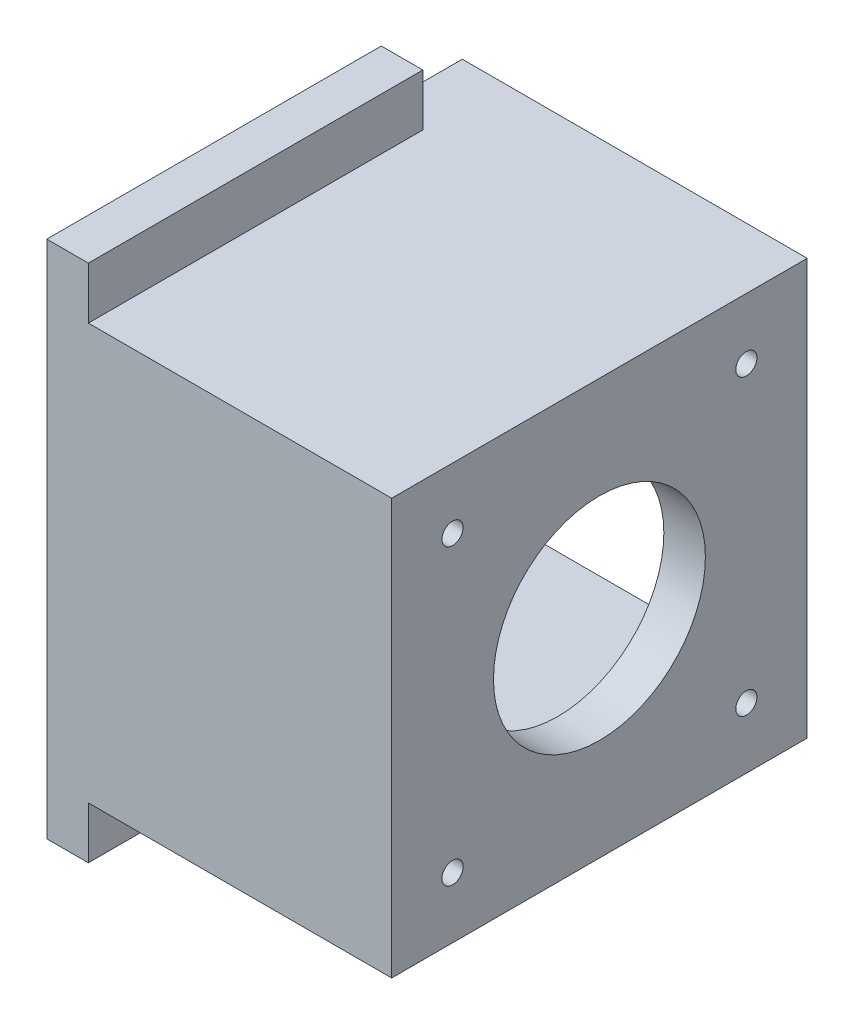
ISO-10303-21;
HEADER;
FILE_DESCRIPTION(('STEP AP214'),'2;1');
FILE_NAME('part.step','',(''),(''),'','','');
FILE_SCHEMA(('AUTOMOTIVE_DESIGN { 1 0 10303 214 1 1 1 1 }'));
ENDSEC;
DATA;
#1=APPLICATION_CONTEXT('core data for automotive mechanical design processes');
#2=APPLICATION_PROTOCOL_DEFINITION('international standard','automotive_design',2000,#1);
#3=PRODUCT_CONTEXT('',#1,'mechanical');
#4=PRODUCT('Part','Part','',(#3));
#5=PRODUCT_RELATED_PRODUCT_CATEGORY('part','',(#4));
#6=PRODUCT_DEFINITION_FORMATION('','',#4);
#7=PRODUCT_DEFINITION_CONTEXT('part definition',#1,'design');
#8=PRODUCT_DEFINITION('design','',#6,#7);
#9=PRODUCT_DEFINITION_SHAPE('','',#8);
#10=(LENGTH_UNIT() NAMED_UNIT(*) SI_UNIT(.MILLI.,.METRE.));
#11=(NAMED_UNIT(*) PLANE_ANGLE_UNIT() SI_UNIT($,.RADIAN.));
#12=(NAMED_UNIT(*) SI_UNIT($,.STERADIAN.) SOLID_ANGLE_UNIT());
#13=UNCERTAINTY_MEASURE_WITH_UNIT(LENGTH_MEASURE(1.E-05),#10,'distance_accuracy_value','');
#14=(GEOMETRIC_REPRESENTATION_CONTEXT(3) GLOBAL_UNCERTAINTY_ASSIGNED_CONTEXT((#13)) GLOBAL_UNIT_ASSIGNED_CONTEXT((#10,
#11,#12)) REPRESENTATION_CONTEXT('',''));
#15=CARTESIAN_POINT('',(0.,0.,0.));
#16=DIRECTION('',(0.,0.,1.));
#17=DIRECTION('',(1.,0.,0.));
#18=AXIS2_PLACEMENT_3D('',#15,#16,#17);
#19=CARTESIAN_POINT('',(0.,0.,-200.));
#20=DIRECTION('',(-1.,0.,0.));
#21=DIRECTION('',(0.,0.,1.));
#22=AXIS2_PLACEMENT_3D('',#19,#20,#21);
#23=PLANE('',#22);
#24=CARTESIAN_POINT('',(0.,125.,-100.));
#25=DIRECTION('',(-1.,0.,0.));
#26=DIRECTION('',(0.,0.,1.));
#27=AXIS2_PLACEMENT_3D('',#24,#25,#26);
#28=CIRCLE('',#27,57.15);
#29=CARTESIAN_POINT('',(0.,125.,-42.85));
#30=VERTEX_POINT('',#29);
#31=EDGE_CURVE('E286',#30,#30,#28,.T.);
#32=ORIENTED_EDGE('',*,*,#31,.F.);
#33=EDGE_LOOP('',(#32));
#34=FACE_BOUND('',#33,.T.);
#35=DIRECTION('',(0.,1.,0.));
#36=VECTOR('',#35,1.);
#37=CARTESIAN_POINT('',(0.,250.,-161.));
#38=LINE('',#37,#36);
#39=CARTESIAN_POINT('',(0.,225.,-161.));
#40=VERTEX_POINT('',#39);
#41=CARTESIAN_POINT('',(0.,250.,-161.));
#42=VERTEX_POINT('',#41);
#43=EDGE_CURVE('E196',#40,#42,#38,.T.);
#44=ORIENTED_EDGE('',*,*,#43,.F.);
#45=DIRECTION('',(0.,0.,1.));
#46=VECTOR('',#45,1.);
#47=CARTESIAN_POINT('',(0.,225.,-200.));
#48=LINE('',#47,#46);
#49=CARTESIAN_POINT('',(0.,225.,-200.));
#50=VERTEX_POINT('',#49);
#51=EDGE_CURVE('E197',#50,#40,#48,.T.);
#52=ORIENTED_EDGE('',*,*,#51,.F.);
#53=DIRECTION('',(0.,-1.,0.));
#54=VECTOR('',#53,1.);
#55=CARTESIAN_POINT('',(0.,0.,-200.));
#56=LINE('',#55,#54);
#57=CARTESIAN_POINT('',(0.,25.,-200.));
#58=VERTEX_POINT('',#57);
#59=EDGE_CURVE('E217',#50,#58,#56,.T.);
#60=ORIENTED_EDGE('',*,*,#59,.T.);
#61=DIRECTION('',(0.,0.,-1.));
#62=VECTOR('',#61,1.);
#63=CARTESIAN_POINT('',(0.,25.,-200.));
#64=LINE('',#63,#62);
#65=CARTESIAN_POINT('',(0.,25.,-161.));
#66=VERTEX_POINT('',#65);
#67=EDGE_CURVE('E211',#66,#58,#64,.T.);
#68=ORIENTED_EDGE('',*,*,#67,.F.);
#69=DIRECTION('',(0.,1.,0.));
#70=VECTOR('',#69,1.);
#71=CARTESIAN_POINT('',(0.,25.,-161.));
#72=LINE('',#71,#70);
#73=CARTESIAN_POINT('',(0.,0.,-161.));
#74=VERTEX_POINT('',#73);
#75=EDGE_CURVE('E200',#74,#66,#72,.T.);
#76=ORIENTED_EDGE('',*,*,#75,.F.);
#77=DIRECTION('',(0.,0.,1.));
#78=VECTOR('',#77,1.);
#79=CARTESIAN_POINT('',(0.,0.,-200.));
#80=LINE('',#79,#78);
#81=CARTESIAN_POINT('',(0.,0.,0.));
#82=VERTEX_POINT('',#81);
#83=EDGE_CURVE('E227',#74,#82,#80,.T.);
#84=ORIENTED_EDGE('',*,*,#83,.T.);
#85=DIRECTION('',(0.,-1.,0.));
#86=VECTOR('',#85,1.);
#87=CARTESIAN_POINT('',(0.,0.,0.));
#88=LINE('',#87,#86);
#89=CARTESIAN_POINT('',(0.,250.,0.));
#90=VERTEX_POINT('',#89);
#91=EDGE_CURVE('E205',#90,#82,#88,.T.);
#92=ORIENTED_EDGE('',*,*,#91,.F.);
#93=DIRECTION('',(0.,0.,1.));
#94=VECTOR('',#93,1.);
#95=CARTESIAN_POINT('',(0.,250.,-200.));
#96=LINE('',#95,#94);
#97=EDGE_CURVE('E11',#42,#90,#96,.T.);
#98=ORIENTED_EDGE('',*,*,#97,.F.);
#99=EDGE_LOOP('',(#44,#52,#60,#68,#76,#84,#92,#98));
#100=FACE_BOUND('',#99,.T.);
#101=ADVANCED_FACE('F47',(#34,#100),#23,.T.);
#102=CARTESIAN_POINT('',(0.,250.,-200.));
#103=DIRECTION('',(0.,1.,0.));
#104=DIRECTION('',(0.,0.,1.));
#105=AXIS2_PLACEMENT_3D('',#102,#103,#104);
#106=PLANE('',#105);
#107=DIRECTION('',(-1.,0.,0.));
#108=VECTOR('',#107,1.);
#109=CARTESIAN_POINT('',(20.,250.,-161.));
#110=LINE('',#109,#108);
#111=CARTESIAN_POINT('',(20.,250.,-161.));
#112=VERTEX_POINT('',#111);
#113=EDGE_CURVE('E202',#112,#42,#110,.T.);
#114=ORIENTED_EDGE('',*,*,#113,.T.);
#115=ORIENTED_EDGE('',*,*,#97,.T.);
#116=DIRECTION('',(-1.,0.,0.));
#117=VECTOR('',#116,1.);
#118=CARTESIAN_POINT('',(0.,250.,0.));
#119=LINE('',#118,#117);
#120=CARTESIAN_POINT('',(20.,250.,0.));
#121=VERTEX_POINT('',#120);
#122=EDGE_CURVE('E220',#121,#90,#119,.T.);
#123=ORIENTED_EDGE('',*,*,#122,.F.);
#124=DIRECTION('',(0.,0.,1.));
#125=VECTOR('',#124,1.);
#126=CARTESIAN_POINT('',(20.,250.,-200.));
#127=LINE('',#126,#125);
#128=EDGE_CURVE('E55',#112,#121,#127,.T.);
#129=ORIENTED_EDGE('',*,*,#128,.F.);
#130=EDGE_LOOP('',(#114,#115,#123,#129));
#131=FACE_BOUND('',#130,.T.);
#132=ADVANCED_FACE('F325',(#131),#106,.T.);
#133=CARTESIAN_POINT('',(20.0000000000001,225.,-200.));
#134=DIRECTION('',(1.,0.,0.));
#135=DIRECTION('',(0.,1.,0.));
#136=AXIS2_PLACEMENT_3D('',#133,#134,#135);
#137=PLANE('',#136);
#138=DIRECTION('',(0.,1.,0.));
#139=VECTOR('',#138,1.);
#140=CARTESIAN_POINT('',(20.,250.,-161.));
#141=LINE('',#140,#139);
#142=CARTESIAN_POINT('',(20.,225.,-161.));
#143=VERTEX_POINT('',#142);
#144=EDGE_CURVE('E192',#143,#112,#141,.T.);
#145=ORIENTED_EDGE('',*,*,#144,.T.);
#146=ORIENTED_EDGE('',*,*,#128,.T.);
#147=DIRECTION('',(0.,1.,0.));
#148=VECTOR('',#147,1.);
#149=CARTESIAN_POINT('',(20.0000000000001,225.,0.));
#150=LINE('',#149,#148);
#151=CARTESIAN_POINT('',(20.0000000000001,225.,0.));
#152=VERTEX_POINT('',#151);
#153=EDGE_CURVE('E245',#152,#121,#150,.T.);
#154=ORIENTED_EDGE('',*,*,#153,.F.);
#155=DIRECTION('',(0.,0.,1.));
#156=VECTOR('',#155,1.);
#157=CARTESIAN_POINT('',(20.0000000000001,225.,-200.));
#158=LINE('',#157,#156);
#159=EDGE_CURVE('E251',#143,#152,#158,.T.);
#160=ORIENTED_EDGE('',*,*,#159,.F.);
#161=EDGE_LOOP('',(#145,#146,#154,#160));
#162=FACE_BOUND('',#161,.T.);
#163=ADVANCED_FACE('F332',(#162),#137,.T.);
#164=CARTESIAN_POINT('',(20.0000000000001,225.,-200.));
#165=DIRECTION('',(0.,1.,0.));
#166=DIRECTION('',(0.,0.,1.));
#167=AXIS2_PLACEMENT_3D('',#164,#165,#166);
#168=PLANE('',#167);
#169=DIRECTION('',(-1.,0.,0.));
#170=VECTOR('',#169,1.);
#171=CARTESIAN_POINT('',(20.0000000000001,225.,0.));
#172=LINE('',#171,#170);
#173=CARTESIAN_POINT('',(166.,225.,0.));
#174=VERTEX_POINT('',#173);
#175=EDGE_CURVE('E242',#174,#152,#172,.T.);
#176=ORIENTED_EDGE('',*,*,#175,.F.);
#177=DIRECTION('',(0.,0.,1.));
#178=VECTOR('',#177,1.);
#179=CARTESIAN_POINT('',(166.,225.,-200.));
#180=LINE('',#179,#178);
#181=CARTESIAN_POINT('',(166.,225.,-200.));
#182=VERTEX_POINT('',#181);
#183=EDGE_CURVE('E253',#182,#174,#180,.T.);
#184=ORIENTED_EDGE('',*,*,#183,.F.);
#185=DIRECTION('',(-1.,0.,0.));
#186=VECTOR('',#185,1.);
#187=CARTESIAN_POINT('',(20.0000000000001,225.,-200.));
#188=LINE('',#187,#186);
#189=EDGE_CURVE('E225',#182,#50,#188,.T.);
#190=ORIENTED_EDGE('',*,*,#189,.T.);
#191=ORIENTED_EDGE('',*,*,#51,.T.);
#192=DIRECTION('',(-1.,0.,0.));
#193=VECTOR('',#192,1.);
#194=CARTESIAN_POINT('',(20.,225.,-161.));
#195=LINE('',#194,#193);
#196=EDGE_CURVE('E195',#143,#40,#195,.T.);
#197=ORIENTED_EDGE('',*,*,#196,.F.);
#198=ORIENTED_EDGE('',*,*,#159,.T.);
#199=EDGE_LOOP('',(#176,#184,#190,#191,#197,#198));
#200=FACE_BOUND('',#199,.T.);
#201=ADVANCED_FACE('F352',(#200),#168,.T.);
#202=CARTESIAN_POINT('',(166.,25.,-200.));
#203=DIRECTION('',(1.,0.,0.));
#204=DIRECTION('',(0.,0.,-1.));
#205=AXIS2_PLACEMENT_3D('',#202,#203,#204);
#206=PLANE('',#205);
#207=CARTESIAN_POINT('',(166.,54.2900000000008,-170.711356230807));
#208=DIRECTION('',(1.,0.,0.));
#209=DIRECTION('',(0.,0.,-1.));
#210=AXIS2_PLACEMENT_3D('',#207,#208,#209);
#211=CIRCLE('',#210,5.09999999999999);
#212=CARTESIAN_POINT('',(166.,54.2900000000008,-175.811356230807));
#213=VERTEX_POINT('',#212);
#214=EDGE_CURVE('E278',#213,#213,#211,.T.);
#215=ORIENTED_EDGE('',*,*,#214,.F.);
#216=EDGE_LOOP('',(#215));
#217=FACE_BOUND('',#216,.T.);
#218=CARTESIAN_POINT('',(166.,54.2886437691936,-29.29));
#219=DIRECTION('',(1.,0.,0.));
#220=DIRECTION('',(0.,0.,-1.));
#221=AXIS2_PLACEMENT_3D('',#218,#219,#220);
#222=CIRCLE('',#221,5.09999999999999);
#223=CARTESIAN_POINT('',(166.,54.2886437691936,-34.39));
#224=VERTEX_POINT('',#223);
#225=EDGE_CURVE('E268',#224,#224,#222,.T.);
#226=ORIENTED_EDGE('',*,*,#225,.F.);
#227=EDGE_LOOP('',(#226));
#228=FACE_BOUND('',#227,.T.);
#229=CARTESIAN_POINT('',(166.,195.71,-29.2886437691933));
#230=DIRECTION('',(1.,0.,0.));
#231=DIRECTION('',(0.,0.,-1.));
#232=AXIS2_PLACEMENT_3D('',#229,#230,#231);
#233=CIRCLE('',#232,5.09999999999999);
#234=CARTESIAN_POINT('',(166.,195.71,-34.3886437691933));
#235=VERTEX_POINT('',#234);
#236=EDGE_CURVE('E265',#235,#235,#233,.T.);
#237=ORIENTED_EDGE('',*,*,#236,.F.);
#238=EDGE_LOOP('',(#237));
#239=FACE_BOUND('',#238,.T.);
#240=CARTESIAN_POINT('',(166.,195.711356230806,-170.71));
#241=DIRECTION('',(1.,0.,0.));
#242=DIRECTION('',(0.,0.,-1.));
#243=AXIS2_PLACEMENT_3D('',#240,#241,#242);
#244=CIRCLE('',#243,5.09999999999999);
#245=CARTESIAN_POINT('',(166.,195.711356230806,-175.81));
#246=VERTEX_POINT('',#245);
#247=EDGE_CURVE('E264',#246,#246,#244,.T.);
#248=ORIENTED_EDGE('',*,*,#247,.F.);
#249=EDGE_LOOP('',(#248));
#250=FACE_BOUND('',#249,.T.);
#251=CARTESIAN_POINT('',(166.,125.,-100.));
#252=DIRECTION('',(1.,0.,0.));
#253=DIRECTION('',(0.,0.,-1.));
#254=AXIS2_PLACEMENT_3D('',#251,#252,#253);
#255=CIRCLE('',#254,51.);
#256=CARTESIAN_POINT('',(166.,125.,-151.));
#257=VERTEX_POINT('',#256);
#258=EDGE_CURVE('E297',#257,#257,#255,.T.);
#259=ORIENTED_EDGE('',*,*,#258,.F.);
#260=EDGE_LOOP('',(#259));
#261=FACE_BOUND('',#260,.T.);
#262=DIRECTION('',(0.,1.,0.));
#263=VECTOR('',#262,1.);
#264=CARTESIAN_POINT('',(166.,25.,0.));
#265=LINE('',#264,#263);
#266=CARTESIAN_POINT('',(166.,25.,0.));
#267=VERTEX_POINT('',#266);
#268=EDGE_CURVE('E239',#267,#174,#265,.T.);
#269=ORIENTED_EDGE('',*,*,#268,.F.);
#270=DIRECTION('',(0.,0.,1.));
#271=VECTOR('',#270,1.);
#272=CARTESIAN_POINT('',(166.,25.,-200.));
#273=LINE('',#272,#271);
#274=CARTESIAN_POINT('',(166.,25.,-200.));
#275=VERTEX_POINT('',#274);
#276=EDGE_CURVE('E255',#275,#267,#273,.T.);
#277=ORIENTED_EDGE('',*,*,#276,.F.);
#278=DIRECTION('',(0.,1.,0.));
#279=VECTOR('',#278,1.);
#280=CARTESIAN_POINT('',(166.,25.,-200.));
#281=LINE('',#280,#279);
#282=EDGE_CURVE('E222',#275,#182,#281,.T.);
#283=ORIENTED_EDGE('',*,*,#282,.T.);
#284=ORIENTED_EDGE('',*,*,#183,.T.);
#285=EDGE_LOOP('',(#269,#277,#283,#284));
#286=FACE_BOUND('',#285,.T.);
#287=ADVANCED_FACE('F356',(#217,#228,#239,#250,#261,#286),#206,.T.);
#288=CARTESIAN_POINT('',(20.0000000000001,25.,-200.));
#289=DIRECTION('',(0.,-1.,0.));
#290=DIRECTION('',(0.,0.,-1.));
#291=AXIS2_PLACEMENT_3D('',#288,#289,#290);
#292=PLANE('',#291);
#293=DIRECTION('',(1.,0.,0.));
#294=VECTOR('',#293,1.);
#295=CARTESIAN_POINT('',(20.0000000000001,25.,0.));
#296=LINE('',#295,#294);
#297=CARTESIAN_POINT('',(20.0000000000001,25.,0.));
#298=VERTEX_POINT('',#297);
#299=EDGE_CURVE('E236',#298,#267,#296,.T.);
#300=ORIENTED_EDGE('',*,*,#299,.F.);
#301=DIRECTION('',(0.,0.,1.));
#302=VECTOR('',#301,1.);
#303=CARTESIAN_POINT('',(20.0000000000001,25.,-200.));
#304=LINE('',#303,#302);
#305=CARTESIAN_POINT('',(20.,25.,-161.));
#306=VERTEX_POINT('',#305);
#307=EDGE_CURVE('E257',#306,#298,#304,.T.);
#308=ORIENTED_EDGE('',*,*,#307,.F.);
#309=DIRECTION('',(-1.,0.,0.));
#310=VECTOR('',#309,1.);
#311=CARTESIAN_POINT('',(20.,25.,-161.));
#312=LINE('',#311,#310);
#313=EDGE_CURVE('E207',#306,#66,#312,.T.);
#314=ORIENTED_EDGE('',*,*,#313,.T.);
#315=ORIENTED_EDGE('',*,*,#67,.T.);
#316=DIRECTION('',(1.,0.,0.));
#317=VECTOR('',#316,1.);
#318=CARTESIAN_POINT('',(20.0000000000001,25.,-200.));
#319=LINE('',#318,#317);
#320=EDGE_CURVE('E71',#58,#275,#319,.T.);
#321=ORIENTED_EDGE('',*,*,#320,.T.);
#322=ORIENTED_EDGE('',*,*,#276,.T.);
#323=EDGE_LOOP('',(#300,#308,#314,#315,#321,#322));
#324=FACE_BOUND('',#323,.T.);
#325=ADVANCED_FACE('F359',(#324),#292,.T.);
#326=CARTESIAN_POINT('',(20.,0.,-200.));
#327=DIRECTION('',(1.,0.,0.));
#328=DIRECTION('',(0.,1.,0.));
#329=AXIS2_PLACEMENT_3D('',#326,#327,#328);
#330=PLANE('',#329);
#331=DIRECTION('',(0.,1.,0.));
#332=VECTOR('',#331,1.);
#333=CARTESIAN_POINT('',(20.,25.,-161.));
#334=LINE('',#333,#332);
#335=CARTESIAN_POINT('',(20.,0.,-161.));
#336=VERTEX_POINT('',#335);
#337=EDGE_CURVE('E209',#336,#306,#334,.T.);
#338=ORIENTED_EDGE('',*,*,#337,.T.);
#339=ORIENTED_EDGE('',*,*,#307,.T.);
#340=DIRECTION('',(0.,1.,0.));
#341=VECTOR('',#340,1.);
#342=CARTESIAN_POINT('',(20.,0.,0.));
#343=LINE('',#342,#341);
#344=CARTESIAN_POINT('',(20.,0.,0.));
#345=VERTEX_POINT('',#344);
#346=EDGE_CURVE('E233',#345,#298,#343,.T.);
#347=ORIENTED_EDGE('',*,*,#346,.F.);
#348=DIRECTION('',(0.,0.,1.));
#349=VECTOR('',#348,1.);
#350=CARTESIAN_POINT('',(20.,0.,-200.));
#351=LINE('',#350,#349);
#352=EDGE_CURVE('E259',#336,#345,#351,.T.);
#353=ORIENTED_EDGE('',*,*,#352,.F.);
#354=EDGE_LOOP('',(#338,#339,#347,#353));
#355=FACE_BOUND('',#354,.T.);
#356=ADVANCED_FACE('F372',(#355),#330,.T.);
#357=CARTESIAN_POINT('',(0.,0.,-200.));
#358=DIRECTION('',(0.,-1.,0.));
#359=DIRECTION('',(0.,0.,-1.));
#360=AXIS2_PLACEMENT_3D('',#357,#358,#359);
#361=PLANE('',#360);
#362=DIRECTION('',(-1.,0.,0.));
#363=VECTOR('',#362,1.);
#364=CARTESIAN_POINT('',(20.,0.,-161.));
#365=LINE('',#364,#363);
#366=EDGE_CURVE('E188',#336,#74,#365,.T.);
#367=ORIENTED_EDGE('',*,*,#366,.F.);
#368=ORIENTED_EDGE('',*,*,#352,.T.);
#369=DIRECTION('',(1.,0.,0.));
#370=VECTOR('',#369,1.);
#371=CARTESIAN_POINT('',(0.,0.,0.));
#372=LINE('',#371,#370);
#373=EDGE_CURVE('E230',#82,#345,#372,.T.);
#374=ORIENTED_EDGE('',*,*,#373,.F.);
#375=ORIENTED_EDGE('',*,*,#83,.F.);
#376=EDGE_LOOP('',(#367,#368,#374,#375));
#377=FACE_BOUND('',#376,.T.);
#378=ADVANCED_FACE('F368',(#377),#361,.T.);
#379=CARTESIAN_POINT('',(0.,0.,-200.));
#380=DIRECTION('',(0.,0.,-1.));
#381=DIRECTION('',(-1.,0.,0.));
#382=AXIS2_PLACEMENT_3D('',#379,#380,#381);
#383=PLANE('',#382);
#384=DIRECTION('',(0.,-1.,0.));
#385=VECTOR('',#384,1.);
#386=CARTESIAN_POINT('',(146.,202.583335176865,-200.));
#387=LINE('',#386,#385);
#388=CARTESIAN_POINT('',(146.,202.583335176865,-200.));
#389=VERTEX_POINT('',#388);
#390=CARTESIAN_POINT('',(146.,42.5833351768647,-200.));
#391=VERTEX_POINT('',#390);
#392=EDGE_CURVE('E63',#389,#391,#387,.T.);
#393=ORIENTED_EDGE('',*,*,#392,.F.);
#394=DIRECTION('',(1.,0.,0.));
#395=VECTOR('',#394,1.);
#396=CARTESIAN_POINT('',(146.,202.583335176865,-200.));
#397=LINE('',#396,#395);
#398=CARTESIAN_POINT('',(20.,202.583335176865,-200.));
#399=VERTEX_POINT('',#398);
#400=EDGE_CURVE('E170',#399,#389,#397,.T.);
#401=ORIENTED_EDGE('',*,*,#400,.F.);
#402=DIRECTION('',(0.,1.,0.));
#403=VECTOR('',#402,1.);
#404=CARTESIAN_POINT('',(20.,202.583335176865,-200.));
#405=LINE('',#404,#403);
#406=CARTESIAN_POINT('',(19.9999999999999,42.5833351768647,-200.));
#407=VERTEX_POINT('',#406);
#408=EDGE_CURVE('E173',#407,#399,#405,.T.);
#409=ORIENTED_EDGE('',*,*,#408,.F.);
#410=DIRECTION('',(-1.,0.,0.));
#411=VECTOR('',#410,1.);
#412=CARTESIAN_POINT('',(146.,42.5833351768647,-200.));
#413=LINE('',#412,#411);
#414=EDGE_CURVE('E182',#391,#407,#413,.T.);
#415=ORIENTED_EDGE('',*,*,#414,.F.);
#416=EDGE_LOOP('',(#393,#401,#409,#415));
#417=FACE_BOUND('',#416,.T.);
#418=ORIENTED_EDGE('',*,*,#59,.F.);
#419=ORIENTED_EDGE('',*,*,#189,.F.);
#420=ORIENTED_EDGE('',*,*,#282,.F.);
#421=ORIENTED_EDGE('',*,*,#320,.F.);
#422=EDGE_LOOP('',(#418,#419,#420,#421));
#423=FACE_BOUND('',#422,.T.);
#424=ADVANCED_FACE('F354',(#417,#423),#383,.T.);
#425=CARTESIAN_POINT('',(0.,0.,0.));
#426=DIRECTION('',(0.,0.,-1.));
#427=DIRECTION('',(-1.,0.,0.));
#428=AXIS2_PLACEMENT_3D('',#425,#426,#427);
#429=PLANE('',#428);
#430=ORIENTED_EDGE('',*,*,#91,.T.);
#431=ORIENTED_EDGE('',*,*,#373,.T.);
#432=ORIENTED_EDGE('',*,*,#346,.T.);
#433=ORIENTED_EDGE('',*,*,#299,.T.);
#434=ORIENTED_EDGE('',*,*,#268,.T.);
#435=ORIENTED_EDGE('',*,*,#175,.T.);
#436=ORIENTED_EDGE('',*,*,#153,.T.);
#437=ORIENTED_EDGE('',*,*,#122,.T.);
#438=EDGE_LOOP('',(#430,#431,#432,#433,#434,#435,#436,#437));
#439=FACE_BOUND('',#438,.T.);
#440=ADVANCED_FACE('F348',(#439),#429,.F.);
#441=CARTESIAN_POINT('',(20.,25.,-161.));
#442=DIRECTION('',(0.,0.,1.));
#443=DIRECTION('',(0.,-1.,0.));
#444=AXIS2_PLACEMENT_3D('',#441,#442,#443);
#445=PLANE('',#444);
#446=ORIENTED_EDGE('',*,*,#75,.T.);
#447=ORIENTED_EDGE('',*,*,#313,.F.);
#448=ORIENTED_EDGE('',*,*,#337,.F.);
#449=ORIENTED_EDGE('',*,*,#366,.T.);
#450=EDGE_LOOP('',(#446,#447,#448,#449));
#451=FACE_BOUND('',#450,.T.);
#452=ADVANCED_FACE('F320',(#451),#445,.F.);
#453=CARTESIAN_POINT('',(20.,250.,-161.));
#454=DIRECTION('',(0.,0.,1.));
#455=DIRECTION('',(0.,-1.,0.));
#456=AXIS2_PLACEMENT_3D('',#453,#454,#455);
#457=PLANE('',#456);
#458=ORIENTED_EDGE('',*,*,#43,.T.);
#459=ORIENTED_EDGE('',*,*,#113,.F.);
#460=ORIENTED_EDGE('',*,*,#144,.F.);
#461=ORIENTED_EDGE('',*,*,#196,.T.);
#462=EDGE_LOOP('',(#458,#459,#460,#461));
#463=FACE_BOUND('',#462,.T.);
#464=ADVANCED_FACE('F308',(#463),#457,.F.);
#465=CARTESIAN_POINT('',(146.,202.583335176865,-20.));
#466=DIRECTION('',(1.,0.,0.));
#467=DIRECTION('',(0.,1.,0.));
#468=AXIS2_PLACEMENT_3D('',#465,#466,#467);
#469=PLANE('',#468);
#470=CARTESIAN_POINT('',(146.,54.2900000000008,-170.711356230807));
#471=DIRECTION('',(1.,0.,0.));
#472=DIRECTION('',(0.,1.,0.));
#473=AXIS2_PLACEMENT_3D('',#470,#471,#472);
#474=CIRCLE('',#473,5.09999999999999);
#475=CARTESIAN_POINT('',(146.,59.3900000000008,-170.711356230807));
#476=VERTEX_POINT('',#475);
#477=EDGE_CURVE('E50',#476,#476,#474,.T.);
#478=ORIENTED_EDGE('',*,*,#477,.T.);
#479=EDGE_LOOP('',(#478));
#480=FACE_BOUND('',#479,.T.);
#481=CARTESIAN_POINT('',(146.,54.2886437691936,-29.29));
#482=DIRECTION('',(1.,0.,0.));
#483=DIRECTION('',(0.,1.,0.));
#484=AXIS2_PLACEMENT_3D('',#481,#482,#483);
#485=CIRCLE('',#484,5.09999999999999);
#486=CARTESIAN_POINT('',(146.,59.3886437691936,-29.29));
#487=VERTEX_POINT('',#486);
#488=EDGE_CURVE('E266',#487,#487,#485,.T.);
#489=ORIENTED_EDGE('',*,*,#488,.T.);
#490=EDGE_LOOP('',(#489));
#491=FACE_BOUND('',#490,.T.);
#492=CARTESIAN_POINT('',(146.,195.71,-29.2886437691933));
#493=DIRECTION('',(1.,0.,0.));
#494=DIRECTION('',(0.,1.,0.));
#495=AXIS2_PLACEMENT_3D('',#492,#493,#494);
#496=CIRCLE('',#495,5.09999999999999);
#497=CARTESIAN_POINT('',(146.,200.81,-29.2886437691933));
#498=VERTEX_POINT('',#497);
#499=EDGE_CURVE('E262',#498,#498,#496,.T.);
#500=ORIENTED_EDGE('',*,*,#499,.T.);
#501=EDGE_LOOP('',(#500));
#502=FACE_BOUND('',#501,.T.);
#503=CARTESIAN_POINT('',(146.,195.711356230806,-170.71));
#504=DIRECTION('',(1.,0.,0.));
#505=DIRECTION('',(0.,1.,0.));
#506=AXIS2_PLACEMENT_3D('',#503,#504,#505);
#507=CIRCLE('',#506,5.09999999999999);
#508=CARTESIAN_POINT('',(146.,200.811356230806,-170.71));
#509=VERTEX_POINT('',#508);
#510=EDGE_CURVE('E283',#509,#509,#507,.T.);
#511=ORIENTED_EDGE('',*,*,#510,.T.);
#512=EDGE_LOOP('',(#511));
#513=FACE_BOUND('',#512,.T.);
#514=CARTESIAN_POINT('',(146.,125.,-100.));
#515=DIRECTION('',(1.,0.,0.));
#516=DIRECTION('',(0.,1.,0.));
#517=AXIS2_PLACEMENT_3D('',#514,#515,#516);
#518=CIRCLE('',#517,51.);
#519=CARTESIAN_POINT('',(146.,176.,-100.));
#520=VERTEX_POINT('',#519);
#521=EDGE_CURVE('E176',#520,#520,#518,.F.);
#522=ORIENTED_EDGE('',*,*,#521,.F.);
#523=EDGE_LOOP('',(#522));
#524=FACE_BOUND('',#523,.T.);
#525=ORIENTED_EDGE('',*,*,#392,.T.);
#526=DIRECTION('',(0.,0.,-1.));
#527=VECTOR('',#526,1.);
#528=CARTESIAN_POINT('',(146.,42.5833351768647,-20.));
#529=LINE('',#528,#527);
#530=CARTESIAN_POINT('',(146.,42.5833351768647,-20.));
#531=VERTEX_POINT('',#530);
#532=EDGE_CURVE('E148',#531,#391,#529,.T.);
#533=ORIENTED_EDGE('',*,*,#532,.F.);
#534=DIRECTION('',(0.,-1.,0.));
#535=VECTOR('',#534,1.);
#536=CARTESIAN_POINT('',(146.,202.583335176865,-20.));
#537=LINE('',#536,#535);
#538=CARTESIAN_POINT('',(146.,202.583335176865,-20.));
#539=VERTEX_POINT('',#538);
#540=EDGE_CURVE('E152',#539,#531,#537,.T.);
#541=ORIENTED_EDGE('',*,*,#540,.F.);
#542=DIRECTION('',(0.,0.,-1.));
#543=VECTOR('',#542,1.);
#544=CARTESIAN_POINT('',(146.,202.583335176865,-20.));
#545=LINE('',#544,#543);
#546=EDGE_CURVE('E186',#539,#389,#545,.T.);
#547=ORIENTED_EDGE('',*,*,#546,.T.);
#548=EDGE_LOOP('',(#525,#533,#541,#547));
#549=FACE_BOUND('',#548,.T.);
#550=ADVANCED_FACE('F150',(#480,#491,#502,#513,#524,#549),#469,.F.);
#551=CARTESIAN_POINT('',(146.,202.583335176865,-20.));
#552=DIRECTION('',(0.,1.,0.));
#553=DIRECTION('',(0.,0.,1.));
#554=AXIS2_PLACEMENT_3D('',#551,#552,#553);
#555=PLANE('',#554);
#556=ORIENTED_EDGE('',*,*,#400,.T.);
#557=ORIENTED_EDGE('',*,*,#546,.F.);
#558=DIRECTION('',(1.,0.,0.));
#559=VECTOR('',#558,1.);
#560=CARTESIAN_POINT('',(146.,202.583335176865,-20.));
#561=LINE('',#560,#559);
#562=CARTESIAN_POINT('',(20.,202.583335176865,-20.));
#563=VERTEX_POINT('',#562);
#564=EDGE_CURVE('E158',#563,#539,#561,.T.);
#565=ORIENTED_EDGE('',*,*,#564,.F.);
#566=DIRECTION('',(0.,0.,-1.));
#567=VECTOR('',#566,1.);
#568=CARTESIAN_POINT('',(20.,202.583335176865,-20.));
#569=LINE('',#568,#567);
#570=EDGE_CURVE('E189',#563,#399,#569,.T.);
#571=ORIENTED_EDGE('',*,*,#570,.T.);
#572=EDGE_LOOP('',(#556,#557,#565,#571));
#573=FACE_BOUND('',#572,.T.);
#574=ADVANCED_FACE('F307',(#573),#555,.F.);
#575=CARTESIAN_POINT('',(20.,202.583335176865,-20.));
#576=DIRECTION('',(-1.,0.,0.));
#577=DIRECTION('',(0.,-1.,0.));
#578=AXIS2_PLACEMENT_3D('',#575,#576,#577);
#579=PLANE('',#578);
#580=CARTESIAN_POINT('',(19.9999999999999,125.,-100.));
#581=DIRECTION('',(1.,0.,0.));
#582=DIRECTION('',(0.,1.,0.));
#583=AXIS2_PLACEMENT_3D('',#580,#581,#582);
#584=CIRCLE('',#583,25.5);
#585=CARTESIAN_POINT('',(19.9999999999999,150.5,-100.));
#586=VERTEX_POINT('',#585);
#587=EDGE_CURVE('E295',#586,#586,#584,.T.);
#588=ORIENTED_EDGE('',*,*,#587,.F.);
#589=EDGE_LOOP('',(#588));
#590=FACE_BOUND('',#589,.T.);
#591=ORIENTED_EDGE('',*,*,#408,.T.);
#592=ORIENTED_EDGE('',*,*,#570,.F.);
#593=DIRECTION('',(0.,1.,0.));
#594=VECTOR('',#593,1.);
#595=CARTESIAN_POINT('',(20.,202.583335176865,-20.));
#596=LINE('',#595,#594);
#597=CARTESIAN_POINT('',(19.9999999999999,42.5833351768647,-20.));
#598=VERTEX_POINT('',#597);
#599=EDGE_CURVE('E166',#598,#563,#596,.T.);
#600=ORIENTED_EDGE('',*,*,#599,.F.);
#601=DIRECTION('',(0.,0.,-1.));
#602=VECTOR('',#601,1.);
#603=CARTESIAN_POINT('',(19.9999999999999,42.5833351768647,-20.));
#604=LINE('',#603,#602);
#605=EDGE_CURVE('E157',#598,#407,#604,.T.);
#606=ORIENTED_EDGE('',*,*,#605,.T.);
#607=EDGE_LOOP('',(#591,#592,#600,#606));
#608=FACE_BOUND('',#607,.T.);
#609=ADVANCED_FACE('F316',(#590,#608),#579,.F.);
#610=CARTESIAN_POINT('',(146.,42.5833351768647,-20.));
#611=DIRECTION('',(0.,-1.,0.));
#612=DIRECTION('',(1.,0.,0.));
#613=AXIS2_PLACEMENT_3D('',#610,#611,#612);
#614=PLANE('',#613);
#615=ORIENTED_EDGE('',*,*,#414,.T.);
#616=ORIENTED_EDGE('',*,*,#605,.F.);
#617=DIRECTION('',(-1.,0.,0.));
#618=VECTOR('',#617,1.);
#619=CARTESIAN_POINT('',(146.,42.5833351768647,-20.));
#620=LINE('',#619,#618);
#621=EDGE_CURVE('E161',#531,#598,#620,.T.);
#622=ORIENTED_EDGE('',*,*,#621,.F.);
#623=ORIENTED_EDGE('',*,*,#532,.T.);
#624=EDGE_LOOP('',(#615,#616,#622,#623));
#625=FACE_BOUND('',#624,.T.);
#626=ADVANCED_FACE('F162',(#625),#614,.F.);
#627=CARTESIAN_POINT('',(0.,0.,-20.));
#628=DIRECTION('',(0.,0.,-1.));
#629=DIRECTION('',(-1.,0.,0.));
#630=AXIS2_PLACEMENT_3D('',#627,#628,#629);
#631=PLANE('',#630);
#632=ORIENTED_EDGE('',*,*,#540,.T.);
#633=ORIENTED_EDGE('',*,*,#621,.T.);
#634=ORIENTED_EDGE('',*,*,#599,.T.);
#635=ORIENTED_EDGE('',*,*,#564,.T.);
#636=EDGE_LOOP('',(#632,#633,#634,#635));
#637=FACE_BOUND('',#636,.T.);
#638=ADVANCED_FACE('F168',(#637),#631,.T.);
#639=CARTESIAN_POINT('',(-0.001000000000001,125.,-100.));
#640=DIRECTION('',(1.,0.,0.));
#641=DIRECTION('',(0.,0.,-1.));
#642=AXIS2_PLACEMENT_3D('',#639,#640,#641);
#643=CYLINDRICAL_SURFACE('',#642,51.);
#644=ORIENTED_EDGE('',*,*,#258,.T.);
#645=EDGE_LOOP('',(#644));
#646=FACE_BOUND('',#645,.T.);
#647=ORIENTED_EDGE('',*,*,#521,.T.);
#648=EDGE_LOOP('',(#647));
#649=FACE_BOUND('',#648,.T.);
#650=ADVANCED_FACE('F304',(#646,#649),#643,.F.);
#651=CARTESIAN_POINT('',(4.99999999999995,125.,-100.));
#652=DIRECTION('',(1.,0.,0.));
#653=DIRECTION('',(0.,1.,0.));
#654=AXIS2_PLACEMENT_3D('',#651,#652,#653);
#655=CYLINDRICAL_SURFACE('',#654,25.5);
#656=CARTESIAN_POINT('',(4.99999999999995,125.,-100.));
#657=DIRECTION('',(1.,0.,0.));
#658=DIRECTION('',(0.,1.,0.));
#659=AXIS2_PLACEMENT_3D('',#656,#657,#658);
#660=CIRCLE('',#659,25.5);
#661=CARTESIAN_POINT('',(4.99999999999995,150.5,-100.));
#662=VERTEX_POINT('',#661);
#663=EDGE_CURVE('E290',#662,#662,#660,.T.);
#664=ORIENTED_EDGE('',*,*,#663,.F.);
#665=EDGE_LOOP('',(#664));
#666=FACE_BOUND('',#665,.T.);
#667=ORIENTED_EDGE('',*,*,#587,.T.);
#668=EDGE_LOOP('',(#667));
#669=FACE_BOUND('',#668,.T.);
#670=ADVANCED_FACE('F461',(#666,#669),#655,.F.);
#671=CARTESIAN_POINT('',(5.,125.,-100.));
#672=DIRECTION('',(-1.,0.,0.));
#673=DIRECTION('',(0.,0.,1.));
#674=AXIS2_PLACEMENT_3D('',#671,#672,#673);
#675=PLANE('',#674);
#676=CARTESIAN_POINT('',(5.,125.,-100.));
#677=DIRECTION('',(-1.,0.,0.));
#678=DIRECTION('',(0.,0.,1.));
#679=AXIS2_PLACEMENT_3D('',#676,#677,#678);
#680=CIRCLE('',#679,57.15);
#681=CARTESIAN_POINT('',(5.,125.,-42.85));
#682=VERTEX_POINT('',#681);
#683=EDGE_CURVE('E287',#682,#682,#680,.T.);
#684=ORIENTED_EDGE('',*,*,#683,.T.);
#685=EDGE_LOOP('',(#684));
#686=FACE_BOUND('',#685,.T.);
#687=ORIENTED_EDGE('',*,*,#663,.T.);
#688=EDGE_LOOP('',(#687));
#689=FACE_BOUND('',#688,.T.);
#690=ADVANCED_FACE('F474',(#686,#689),#675,.T.);
#691=CARTESIAN_POINT('',(5.,125.,-100.));
#692=DIRECTION('',(-1.,0.,0.));
#693=DIRECTION('',(0.,0.,1.));
#694=AXIS2_PLACEMENT_3D('',#691,#692,#693);
#695=CYLINDRICAL_SURFACE('',#694,57.15);
#696=ORIENTED_EDGE('',*,*,#683,.F.);
#697=EDGE_LOOP('',(#696));
#698=FACE_BOUND('',#697,.T.);
#699=ORIENTED_EDGE('',*,*,#31,.T.);
#700=EDGE_LOOP('',(#699));
#701=FACE_BOUND('',#700,.T.);
#702=ADVANCED_FACE('F486',(#698,#701),#695,.F.);
#703=CARTESIAN_POINT('',(166.,195.711356230806,-170.71));
#704=DIRECTION('',(1.,0.,0.));
#705=DIRECTION('',(0.,0.,-1.));
#706=AXIS2_PLACEMENT_3D('',#703,#704,#705);
#707=CYLINDRICAL_SURFACE('',#706,5.09999999999999);
#708=ORIENTED_EDGE('',*,*,#247,.T.);
#709=EDGE_LOOP('',(#708));
#710=FACE_BOUND('',#709,.T.);
#711=ORIENTED_EDGE('',*,*,#510,.F.);
#712=EDGE_LOOP('',(#711));
#713=FACE_BOUND('',#712,.T.);
#714=ADVANCED_FACE('F496',(#710,#713),#707,.F.);
#715=CARTESIAN_POINT('',(166.,195.71,-29.2886437691933));
#716=DIRECTION('',(1.,0.,0.));
#717=DIRECTION('',(0.,0.,-1.));
#718=AXIS2_PLACEMENT_3D('',#715,#716,#717);
#719=CYLINDRICAL_SURFACE('',#718,5.09999999999999);
#720=ORIENTED_EDGE('',*,*,#236,.T.);
#721=EDGE_LOOP('',(#720));
#722=FACE_BOUND('',#721,.T.);
#723=ORIENTED_EDGE('',*,*,#499,.F.);
#724=EDGE_LOOP('',(#723));
#725=FACE_BOUND('',#724,.T.);
#726=ADVANCED_FACE('F507',(#722,#725),#719,.F.);
#727=CARTESIAN_POINT('',(166.,54.2886437691936,-29.29));
#728=DIRECTION('',(1.,0.,0.));
#729=DIRECTION('',(0.,0.,-1.));
#730=AXIS2_PLACEMENT_3D('',#727,#728,#729);
#731=CYLINDRICAL_SURFACE('',#730,5.09999999999999);
#732=ORIENTED_EDGE('',*,*,#225,.T.);
#733=EDGE_LOOP('',(#732));
#734=FACE_BOUND('',#733,.T.);
#735=ORIENTED_EDGE('',*,*,#488,.F.);
#736=EDGE_LOOP('',(#735));
#737=FACE_BOUND('',#736,.T.);
#738=ADVANCED_FACE('F518',(#734,#737),#731,.F.);
#739=CARTESIAN_POINT('',(166.,54.2900000000008,-170.711356230807));
#740=DIRECTION('',(1.,0.,0.));
#741=DIRECTION('',(0.,0.,-1.));
#742=AXIS2_PLACEMENT_3D('',#739,#740,#741);
#743=CYLINDRICAL_SURFACE('',#742,5.09999999999999);
#744=ORIENTED_EDGE('',*,*,#214,.T.);
#745=EDGE_LOOP('',(#744));
#746=FACE_BOUND('',#745,.T.);
#747=ORIENTED_EDGE('',*,*,#477,.F.);
#748=EDGE_LOOP('',(#747));
#749=FACE_BOUND('',#748,.T.);
#750=ADVANCED_FACE('F530',(#746,#749),#743,.F.);
#751=CLOSED_SHELL('',(#101,#132,#163,#201,#287,#325,#356,#378,#424,#440,#452,#464,#550,#574,
#609,#626,#638,#650,#670,#690,#702,#714,#726,#738,#750));
#752=MANIFOLD_SOLID_BREP('B2',#751);
#753=ADVANCED_BREP_SHAPE_REPRESENTATION('',(#18,#752),#14);
#754=SHAPE_DEFINITION_REPRESENTATION(#9,#753);
ENDSEC;
END-ISO-10303-21;
